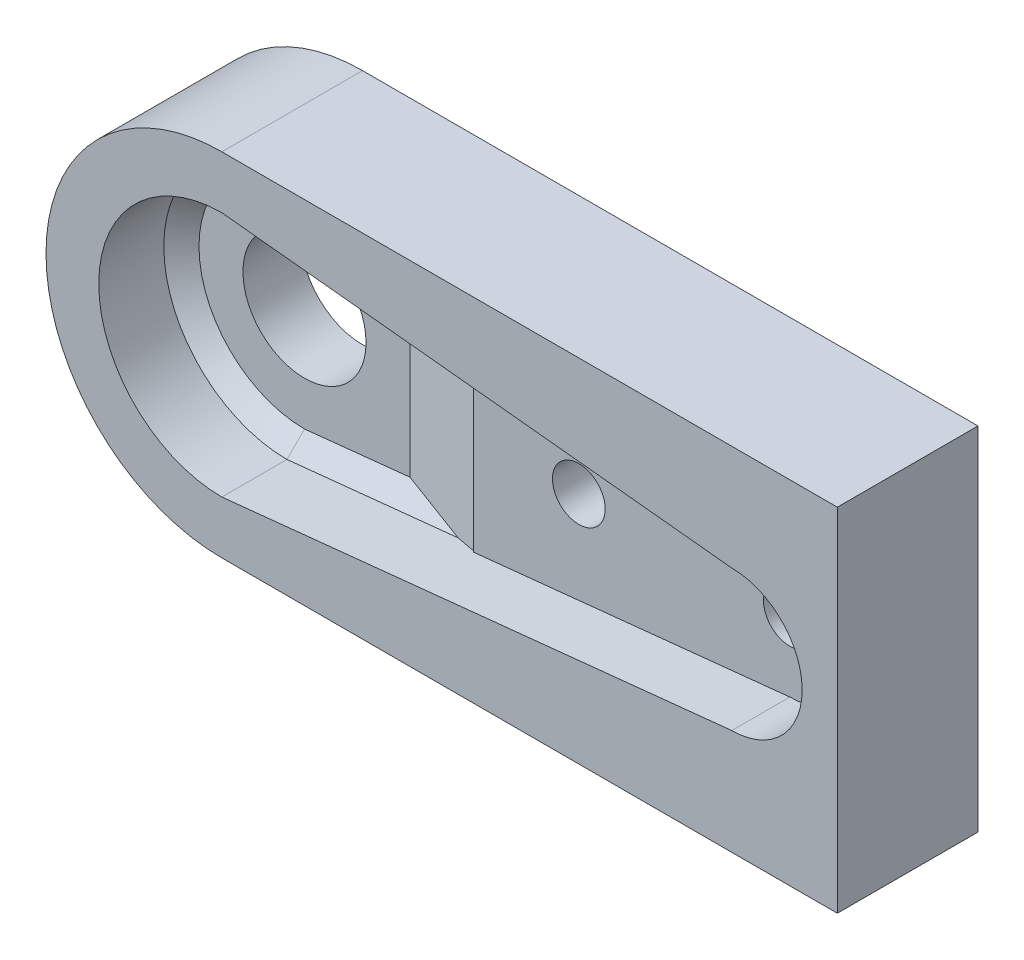
ISO-10303-21;
HEADER;
FILE_DESCRIPTION(('STEP AP214'),'2;1');
FILE_NAME('part.step','',(''),(''),'','','');
FILE_SCHEMA(('AUTOMOTIVE_DESIGN { 1 0 10303 214 1 1 1 1 }'));
ENDSEC;
DATA;
#1=APPLICATION_CONTEXT('core data for automotive mechanical design processes');
#2=APPLICATION_PROTOCOL_DEFINITION('international standard','automotive_design',2000,#1);
#3=PRODUCT_CONTEXT('',#1,'mechanical');
#4=PRODUCT('Part','Part','',(#3));
#5=PRODUCT_RELATED_PRODUCT_CATEGORY('part','',(#4));
#6=PRODUCT_DEFINITION_FORMATION('','',#4);
#7=PRODUCT_DEFINITION_CONTEXT('part definition',#1,'design');
#8=PRODUCT_DEFINITION('design','',#6,#7);
#9=PRODUCT_DEFINITION_SHAPE('','',#8);
#10=(LENGTH_UNIT() NAMED_UNIT(*) SI_UNIT(.MILLI.,.METRE.));
#11=(NAMED_UNIT(*) PLANE_ANGLE_UNIT() SI_UNIT($,.RADIAN.));
#12=(NAMED_UNIT(*) SI_UNIT($,.STERADIAN.) SOLID_ANGLE_UNIT());
#13=UNCERTAINTY_MEASURE_WITH_UNIT(LENGTH_MEASURE(1.E-05),#10,'distance_accuracy_value','');
#14=(GEOMETRIC_REPRESENTATION_CONTEXT(3) GLOBAL_UNCERTAINTY_ASSIGNED_CONTEXT((#13)) GLOBAL_UNIT_ASSIGNED_CONTEXT((#10,
#11,#12)) REPRESENTATION_CONTEXT('',''));
#15=CARTESIAN_POINT('',(0.,0.,0.));
#16=DIRECTION('',(0.,0.,1.));
#17=DIRECTION('',(1.,0.,0.));
#18=AXIS2_PLACEMENT_3D('',#15,#16,#17);
#19=CARTESIAN_POINT('',(0.,3.,4.3));
#20=DIRECTION('',(-0.0727606875108998,0.703353312605365,0.707106781186549));
#21=DIRECTION('',(0.994691793826551,0.102899151085505,0.));
#22=AXIS2_PLACEMENT_3D('',#19,#20,#21);
#23=PLANE('',#22);
#24=CARTESIAN_POINT('',(-0.000546209909035064,4.00528002912067,3.3));
#25=DIRECTION('',(0.994691793826551,0.102899151085505,0.));
#26=VECTOR('',#25,1.);
#27=LINE('',#24,#26);
#28=CARTESIAN_POINT('',(0.,4.00000000000001,3.3));
#29=VERTEX_POINT('',#28);
#30=CARTESIAN_POINT('',(5.99999999999994,4.62602618876643,3.3));
#31=VERTEX_POINT('',#30);
#32=EDGE_CURVE('E197',#29,#31,#27,.T.);
#33=ORIENTED_EDGE('',*,*,#32,.F.);
#34=CARTESIAN_POINT('',(-0.000273104954517369,4.00264001456034,3.30265410308672));
#35=DIRECTION('',(0.000193115045492676,-0.708976050495939,0.70523253082211));
#36=VECTOR('',#35,1.);
#37=LINE('',#34,#36);
#38=CARTESIAN_POINT('',(0.,3.,4.3));
#39=VERTEX_POINT('',#38);
#40=EDGE_CURVE('E206',#29,#39,#37,.T.);
#41=ORIENTED_EDGE('',*,*,#40,.T.);
#42=DIRECTION('',(0.994691793826551,0.102899151085505,0.));
#43=VECTOR('',#42,1.);
#44=CARTESIAN_POINT('',(0.,3.,4.3));
#45=LINE('',#44,#43);
#46=CARTESIAN_POINT('',(9.73205080756886,4.00676387664505,4.3));
#47=VERTEX_POINT('',#46);
#48=EDGE_CURVE('E189',#39,#47,#45,.T.);
#49=ORIENTED_EDGE('',*,*,#48,.T.);
#50=DIRECTION('',(0.953753176121489,-0.158257062267283,0.255557393320368));
#51=VECTOR('',#50,1.);
#52=CARTESIAN_POINT('',(10.9484457034078,3.80492645414208,4.62593203001738));
#53=LINE('',#52,#51);
#54=EDGE_CURVE('E188',#47,#31,#53,.F.);
#55=ORIENTED_EDGE('',*,*,#54,.T.);
#56=EDGE_LOOP('',(#33,#41,#49,#55));
#57=FACE_BOUND('',#56,.T.);
#58=ADVANCED_FACE('F34',(#57),#23,.T.);
#59=CARTESIAN_POINT('',(0.,10.,8.));
#60=DIRECTION('',(0.,0.,1.));
#61=DIRECTION('',(1.,0.,0.));
#62=AXIS2_PLACEMENT_3D('',#59,#60,#61);
#63=PLANE('',#62);
#64=CARTESIAN_POINT('',(0.,10.,8.));
#65=DIRECTION('',(0.,0.,1.));
#66=DIRECTION('',(1.,0.,0.));
#67=AXIS2_PLACEMENT_3D('',#64,#65,#66);
#68=CIRCLE('',#67,10.);
#69=CARTESIAN_POINT('',(0.,20.,8.));
#70=VERTEX_POINT('',#69);
#71=CARTESIAN_POINT('',(0.,0.,8.));
#72=VERTEX_POINT('',#71);
#73=EDGE_CURVE('E497',#70,#72,#68,.T.);
#74=ORIENTED_EDGE('',*,*,#73,.T.);
#75=DIRECTION('',(1.,0.,0.));
#76=VECTOR('',#75,1.);
#77=CARTESIAN_POINT('',(0.,0.,8.));
#78=LINE('',#77,#76);
#79=CARTESIAN_POINT('',(35.,0.,8.));
#80=VERTEX_POINT('',#79);
#81=EDGE_CURVE('E87',#72,#80,#78,.T.);
#82=ORIENTED_EDGE('',*,*,#81,.T.);
#83=DIRECTION('',(0.,1.,0.));
#84=VECTOR('',#83,1.);
#85=CARTESIAN_POINT('',(35.,0.,8.));
#86=LINE('',#85,#84);
#87=CARTESIAN_POINT('',(35.,20.,8.));
#88=VERTEX_POINT('',#87);
#89=EDGE_CURVE('E518',#80,#88,#86,.T.);
#90=ORIENTED_EDGE('',*,*,#89,.T.);
#91=DIRECTION('',(-1.,0.,0.));
#92=VECTOR('',#91,1.);
#93=CARTESIAN_POINT('',(0.,20.,8.));
#94=LINE('',#93,#92);
#95=EDGE_CURVE('E58',#88,#70,#94,.T.);
#96=ORIENTED_EDGE('',*,*,#95,.T.);
#97=EDGE_LOOP('',(#74,#82,#90,#96));
#98=FACE_BOUND('',#97,.T.);
#99=CARTESIAN_POINT('',(0.,10.,8.));
#100=DIRECTION('',(0.,0.,1.));
#101=DIRECTION('',(1.,0.,0.));
#102=AXIS2_PLACEMENT_3D('',#99,#100,#101);
#103=CIRCLE('',#102,7.);
#104=CARTESIAN_POINT('',(0.,3.,8.));
#105=VERTEX_POINT('',#104);
#106=CARTESIAN_POINT('',(0.,17.,8.));
#107=VERTEX_POINT('',#106);
#108=EDGE_CURVE('E43',#105,#107,#103,.F.);
#109=ORIENTED_EDGE('',*,*,#108,.T.);
#110=DIRECTION('',(0.994691793826551,-0.102899151085505,0.));
#111=VECTOR('',#110,1.);
#112=CARTESIAN_POINT('',(0.716470588235294,16.9258823529412,8.));
#113=LINE('',#112,#111);
#114=CARTESIAN_POINT('',(29.,14.,8.));
#115=VERTEX_POINT('',#114);
#116=EDGE_CURVE('E11',#107,#115,#113,.T.);
#117=ORIENTED_EDGE('',*,*,#116,.T.);
#118=CARTESIAN_POINT('',(29.,10.,8.));
#119=DIRECTION('',(0.,0.,1.));
#120=DIRECTION('',(-1.,0.,0.));
#121=AXIS2_PLACEMENT_3D('',#118,#119,#120);
#122=CIRCLE('',#121,4.);
#123=CARTESIAN_POINT('',(29.,6.,8.));
#124=VERTEX_POINT('',#123);
#125=EDGE_CURVE('E165',#124,#115,#122,.T.);
#126=ORIENTED_EDGE('',*,*,#125,.F.);
#127=DIRECTION('',(-0.994691793826551,-0.102899151085505,0.));
#128=VECTOR('',#127,1.);
#129=CARTESIAN_POINT('',(0.716470588235294,3.07411764705882,8.));
#130=LINE('',#129,#128);
#131=EDGE_CURVE('E280',#124,#105,#130,.T.);
#132=ORIENTED_EDGE('',*,*,#131,.T.);
#133=EDGE_LOOP('',(#109,#117,#126,#132));
#134=FACE_BOUND('',#133,.T.);
#135=ADVANCED_FACE('F238',(#98,#134),#63,.T.);
#136=CARTESIAN_POINT('',(0.,10.,8.));
#137=DIRECTION('',(0.,0.,-1.));
#138=DIRECTION('',(-1.,0.,0.));
#139=AXIS2_PLACEMENT_3D('',#136,#137,#138);
#140=CYLINDRICAL_SURFACE('',#139,10.);
#141=CARTESIAN_POINT('',(0.,10.,0.));
#142=DIRECTION('',(0.,0.,1.));
#143=DIRECTION('',(1.,0.,0.));
#144=AXIS2_PLACEMENT_3D('',#141,#142,#143);
#145=CIRCLE('',#144,10.);
#146=CARTESIAN_POINT('',(0.,20.,0.));
#147=VERTEX_POINT('',#146);
#148=CARTESIAN_POINT('',(0.,0.,0.));
#149=VERTEX_POINT('',#148);
#150=EDGE_CURVE('E196',#147,#149,#145,.T.);
#151=ORIENTED_EDGE('',*,*,#150,.T.);
#152=DIRECTION('',(0.,0.,-1.));
#153=VECTOR('',#152,1.);
#154=CARTESIAN_POINT('',(0.,0.,8.));
#155=LINE('',#154,#153);
#156=EDGE_CURVE('E290',#72,#149,#155,.T.);
#157=ORIENTED_EDGE('',*,*,#156,.F.);
#158=ORIENTED_EDGE('',*,*,#73,.F.);
#159=DIRECTION('',(0.,0.,-1.));
#160=VECTOR('',#159,1.);
#161=CARTESIAN_POINT('',(0.,20.,8.));
#162=LINE('',#161,#160);
#163=EDGE_CURVE('E509',#70,#147,#162,.T.);
#164=ORIENTED_EDGE('',*,*,#163,.T.);
#165=EDGE_LOOP('',(#151,#157,#158,#164));
#166=FACE_BOUND('',#165,.T.);
#167=ADVANCED_FACE('F36',(#166),#140,.T.);
#168=CARTESIAN_POINT('',(0.,0.,8.));
#169=DIRECTION('',(0.,1.,0.));
#170=DIRECTION('',(-1.,0.,0.));
#171=AXIS2_PLACEMENT_3D('',#168,#169,#170);
#172=PLANE('',#171);
#173=DIRECTION('',(1.,0.,0.));
#174=VECTOR('',#173,1.);
#175=CARTESIAN_POINT('',(0.,0.,0.));
#176=LINE('',#175,#174);
#177=CARTESIAN_POINT('',(35.,0.,0.));
#178=VERTEX_POINT('',#177);
#179=EDGE_CURVE('E514',#149,#178,#176,.T.);
#180=ORIENTED_EDGE('',*,*,#179,.T.);
#181=DIRECTION('',(0.,0.,-1.));
#182=VECTOR('',#181,1.);
#183=CARTESIAN_POINT('',(35.,0.,8.));
#184=LINE('',#183,#182);
#185=EDGE_CURVE('E502',#80,#178,#184,.T.);
#186=ORIENTED_EDGE('',*,*,#185,.F.);
#187=ORIENTED_EDGE('',*,*,#81,.F.);
#188=ORIENTED_EDGE('',*,*,#156,.T.);
#189=EDGE_LOOP('',(#180,#186,#187,#188));
#190=FACE_BOUND('',#189,.T.);
#191=ADVANCED_FACE('F463',(#190),#172,.F.);
#192=CARTESIAN_POINT('',(35.,0.,8.));
#193=DIRECTION('',(-1.,0.,0.));
#194=DIRECTION('',(0.,-1.,0.));
#195=AXIS2_PLACEMENT_3D('',#192,#193,#194);
#196=PLANE('',#195);
#197=DIRECTION('',(0.,1.,0.));
#198=VECTOR('',#197,1.);
#199=CARTESIAN_POINT('',(35.,0.,0.));
#200=LINE('',#199,#198);
#201=CARTESIAN_POINT('',(35.,20.,0.));
#202=VERTEX_POINT('',#201);
#203=EDGE_CURVE('E512',#178,#202,#200,.T.);
#204=ORIENTED_EDGE('',*,*,#203,.T.);
#205=DIRECTION('',(0.,0.,-1.));
#206=VECTOR('',#205,1.);
#207=CARTESIAN_POINT('',(35.,20.,8.));
#208=LINE('',#207,#206);
#209=EDGE_CURVE('E505',#88,#202,#208,.T.);
#210=ORIENTED_EDGE('',*,*,#209,.F.);
#211=ORIENTED_EDGE('',*,*,#89,.F.);
#212=ORIENTED_EDGE('',*,*,#185,.T.);
#213=EDGE_LOOP('',(#204,#210,#211,#212));
#214=FACE_BOUND('',#213,.T.);
#215=ADVANCED_FACE('F454',(#214),#196,.F.);
#216=CARTESIAN_POINT('',(0.,20.,8.));
#217=DIRECTION('',(0.,-1.,0.));
#218=DIRECTION('',(0.,0.,-1.));
#219=AXIS2_PLACEMENT_3D('',#216,#217,#218);
#220=PLANE('',#219);
#221=DIRECTION('',(-1.,0.,0.));
#222=VECTOR('',#221,1.);
#223=CARTESIAN_POINT('',(0.,20.,0.));
#224=LINE('',#223,#222);
#225=EDGE_CURVE('E79',#202,#147,#224,.T.);
#226=ORIENTED_EDGE('',*,*,#225,.T.);
#227=ORIENTED_EDGE('',*,*,#163,.F.);
#228=ORIENTED_EDGE('',*,*,#95,.F.);
#229=ORIENTED_EDGE('',*,*,#209,.T.);
#230=EDGE_LOOP('',(#226,#227,#228,#229));
#231=FACE_BOUND('',#230,.T.);
#232=ADVANCED_FACE('F449',(#231),#220,.F.);
#233=CARTESIAN_POINT('',(0.,10.,0.));
#234=DIRECTION('',(0.,0.,1.));
#235=DIRECTION('',(1.,0.,0.));
#236=AXIS2_PLACEMENT_3D('',#233,#234,#235);
#237=PLANE('',#236);
#238=CARTESIAN_POINT('',(17.,9.99999999999992,0.));
#239=DIRECTION('',(0.,0.,1.));
#240=DIRECTION('',(1.,0.,0.));
#241=AXIS2_PLACEMENT_3D('',#238,#239,#240);
#242=CIRCLE('',#241,1.5);
#243=CARTESIAN_POINT('',(18.5,9.99999999999992,0.));
#244=VERTEX_POINT('',#243);
#245=EDGE_CURVE('E262',#244,#244,#242,.T.);
#246=ORIENTED_EDGE('',*,*,#245,.T.);
#247=EDGE_LOOP('',(#246));
#248=FACE_BOUND('',#247,.T.);
#249=CARTESIAN_POINT('',(29.,10.,0.));
#250=DIRECTION('',(0.,0.,1.));
#251=DIRECTION('',(1.,0.,0.));
#252=AXIS2_PLACEMENT_3D('',#249,#250,#251);
#253=CIRCLE('',#252,1.5);
#254=CARTESIAN_POINT('',(30.5,10.,0.));
#255=VERTEX_POINT('',#254);
#256=EDGE_CURVE('E267',#255,#255,#253,.T.);
#257=ORIENTED_EDGE('',*,*,#256,.T.);
#258=EDGE_LOOP('',(#257));
#259=FACE_BOUND('',#258,.T.);
#260=CARTESIAN_POINT('',(0.,10.,0.));
#261=DIRECTION('',(0.,0.,1.));
#262=DIRECTION('',(1.,0.,0.));
#263=AXIS2_PLACEMENT_3D('',#260,#261,#262);
#264=CIRCLE('',#263,3.5);
#265=CARTESIAN_POINT('',(3.5,10.,0.));
#266=VERTEX_POINT('',#265);
#267=EDGE_CURVE('E259',#266,#266,#264,.T.);
#268=ORIENTED_EDGE('',*,*,#267,.T.);
#269=EDGE_LOOP('',(#268));
#270=FACE_BOUND('',#269,.T.);
#271=ORIENTED_EDGE('',*,*,#150,.F.);
#272=ORIENTED_EDGE('',*,*,#225,.F.);
#273=ORIENTED_EDGE('',*,*,#203,.F.);
#274=ORIENTED_EDGE('',*,*,#179,.F.);
#275=EDGE_LOOP('',(#271,#272,#273,#274));
#276=FACE_BOUND('',#275,.T.);
#277=ADVANCED_FACE('F319',(#248,#259,#270,#276),#237,.F.);
#278=CARTESIAN_POINT('',(0.,10.,4.7));
#279=DIRECTION('',(0.,0.,1.));
#280=DIRECTION('',(1.,0.,0.));
#281=AXIS2_PLACEMENT_3D('',#278,#279,#280);
#282=PLANE('',#281);
#283=CARTESIAN_POINT('',(17.,9.99999999999992,4.7));
#284=DIRECTION('',(0.,0.,1.));
#285=DIRECTION('',(1.,0.,0.));
#286=AXIS2_PLACEMENT_3D('',#283,#284,#285);
#287=CIRCLE('',#286,1.5);
#288=CARTESIAN_POINT('',(18.5,9.99999999999992,4.7));
#289=VERTEX_POINT('',#288);
#290=EDGE_CURVE('E38',#289,#289,#287,.T.);
#291=ORIENTED_EDGE('',*,*,#290,.F.);
#292=EDGE_LOOP('',(#291));
#293=FACE_BOUND('',#292,.T.);
#294=CARTESIAN_POINT('',(29.,10.,4.7));
#295=DIRECTION('',(0.,0.,1.));
#296=DIRECTION('',(1.,0.,0.));
#297=AXIS2_PLACEMENT_3D('',#294,#295,#296);
#298=CIRCLE('',#297,1.5);
#299=CARTESIAN_POINT('',(30.5,10.,4.7));
#300=VERTEX_POINT('',#299);
#301=EDGE_CURVE('E260',#300,#300,#298,.T.);
#302=ORIENTED_EDGE('',*,*,#301,.F.);
#303=EDGE_LOOP('',(#302));
#304=FACE_BOUND('',#303,.T.);
#305=DIRECTION('',(0.994691793826551,0.102899151085505,0.));
#306=VECTOR('',#305,1.);
#307=CARTESIAN_POINT('',(0.,3.,4.7));
#308=LINE('',#307,#306);
#309=CARTESIAN_POINT('',(11.,4.13793103448276,4.7));
#310=VERTEX_POINT('',#309);
#311=CARTESIAN_POINT('',(29.,6.,4.7));
#312=VERTEX_POINT('',#311);
#313=EDGE_CURVE('E159',#310,#312,#308,.T.);
#314=ORIENTED_EDGE('',*,*,#313,.T.);
#315=CARTESIAN_POINT('',(29.,10.,4.7));
#316=DIRECTION('',(0.,0.,1.));
#317=DIRECTION('',(-1.,0.,0.));
#318=AXIS2_PLACEMENT_3D('',#315,#316,#317);
#319=CIRCLE('',#318,4.);
#320=CARTESIAN_POINT('',(29.,14.,4.7));
#321=VERTEX_POINT('',#320);
#322=EDGE_CURVE('E163',#312,#321,#319,.T.);
#323=ORIENTED_EDGE('',*,*,#322,.T.);
#324=DIRECTION('',(-0.994691793826551,0.102899151085505,0.));
#325=VECTOR('',#324,1.);
#326=CARTESIAN_POINT('',(29.,14.,4.7));
#327=LINE('',#326,#325);
#328=CARTESIAN_POINT('',(11.,15.8620689655172,4.7));
#329=VERTEX_POINT('',#328);
#330=EDGE_CURVE('E144',#321,#329,#327,.T.);
#331=ORIENTED_EDGE('',*,*,#330,.T.);
#332=DIRECTION('',(0.,1.,0.));
#333=VECTOR('',#332,1.);
#334=CARTESIAN_POINT('',(11.,10.,4.7));
#335=LINE('',#334,#333);
#336=EDGE_CURVE('E151',#310,#329,#335,.T.);
#337=ORIENTED_EDGE('',*,*,#336,.F.);
#338=EDGE_LOOP('',(#314,#323,#331,#337));
#339=FACE_BOUND('',#338,.T.);
#340=ADVANCED_FACE('F161',(#293,#304,#339),#282,.T.);
#341=CARTESIAN_POINT('',(0.,10.,8.));
#342=DIRECTION('',(0.,0.,-1.));
#343=DIRECTION('',(-1.,0.,0.));
#344=AXIS2_PLACEMENT_3D('',#341,#342,#343);
#345=CYLINDRICAL_SURFACE('',#344,7.);
#346=DIRECTION('',(0.,0.,-1.));
#347=VECTOR('',#346,1.);
#348=CARTESIAN_POINT('',(0.,3.,8.));
#349=LINE('',#348,#347);
#350=EDGE_CURVE('E179',#105,#39,#349,.T.);
#351=ORIENTED_EDGE('',*,*,#350,.T.);
#352=CARTESIAN_POINT('',(0.,10.,4.3));
#353=DIRECTION('',(0.,0.,1.));
#354=DIRECTION('',(1.,0.,0.));
#355=AXIS2_PLACEMENT_3D('',#352,#353,#354);
#356=CIRCLE('',#355,7.);
#357=CARTESIAN_POINT('',(0.,17.,4.3));
#358=VERTEX_POINT('',#357);
#359=EDGE_CURVE('E288',#358,#39,#356,.T.);
#360=ORIENTED_EDGE('',*,*,#359,.F.);
#361=DIRECTION('',(0.,0.,-1.));
#362=VECTOR('',#361,1.);
#363=CARTESIAN_POINT('',(0.,17.,8.));
#364=LINE('',#363,#362);
#365=EDGE_CURVE('E168',#107,#358,#364,.T.);
#366=ORIENTED_EDGE('',*,*,#365,.F.);
#367=ORIENTED_EDGE('',*,*,#108,.F.);
#368=EDGE_LOOP('',(#351,#360,#366,#367));
#369=FACE_BOUND('',#368,.T.);
#370=ADVANCED_FACE('F287',(#369),#345,.F.);
#371=CARTESIAN_POINT('',(0.,3.,8.));
#372=DIRECTION('',(-0.102899151085505,0.994691793826551,0.));
#373=DIRECTION('',(-0.994691793826551,-0.102899151085505,0.));
#374=AXIS2_PLACEMENT_3D('',#371,#372,#373);
#375=PLANE('',#374);
#376=ORIENTED_EDGE('',*,*,#313,.F.);
#377=DIRECTION('',(0.,0.,1.));
#378=VECTOR('',#377,1.);
#379=CARTESIAN_POINT('',(11.,4.13793103448276,3.3));
#380=LINE('',#379,#378);
#381=CARTESIAN_POINT('',(11.,4.13793103448276,4.63974596215562));
#382=VERTEX_POINT('',#381);
#383=EDGE_CURVE('E152',#382,#310,#380,.T.);
#384=ORIENTED_EDGE('',*,*,#383,.F.);
#385=DIRECTION('',(0.961139410487415,0.0994282148780084,0.257536528853825));
#386=VECTOR('',#385,1.);
#387=CARTESIAN_POINT('',(11.,4.13793103448276,4.63974596215562));
#388=LINE('',#387,#386);
#389=EDGE_CURVE('E181',#47,#382,#388,.T.);
#390=ORIENTED_EDGE('',*,*,#389,.F.);
#391=ORIENTED_EDGE('',*,*,#48,.F.);
#392=ORIENTED_EDGE('',*,*,#350,.F.);
#393=ORIENTED_EDGE('',*,*,#131,.F.);
#394=DIRECTION('',(0.,0.,-1.));
#395=VECTOR('',#394,1.);
#396=CARTESIAN_POINT('',(29.,6.,8.));
#397=LINE('',#396,#395);
#398=EDGE_CURVE('E176',#124,#312,#397,.T.);
#399=ORIENTED_EDGE('',*,*,#398,.T.);
#400=EDGE_LOOP('',(#376,#384,#390,#391,#392,#393,#399));
#401=FACE_BOUND('',#400,.T.);
#402=ADVANCED_FACE('F278',(#401),#375,.T.);
#403=CARTESIAN_POINT('',(29.,10.,8.));
#404=DIRECTION('',(0.,0.,-1.));
#405=DIRECTION('',(-1.,0.,0.));
#406=AXIS2_PLACEMENT_3D('',#403,#404,#405);
#407=CYLINDRICAL_SURFACE('',#406,4.);
#408=ORIENTED_EDGE('',*,*,#322,.F.);
#409=ORIENTED_EDGE('',*,*,#398,.F.);
#410=ORIENTED_EDGE('',*,*,#125,.T.);
#411=DIRECTION('',(0.,0.,-1.));
#412=VECTOR('',#411,1.);
#413=CARTESIAN_POINT('',(29.,14.,8.));
#414=LINE('',#413,#412);
#415=EDGE_CURVE('E174',#115,#321,#414,.T.);
#416=ORIENTED_EDGE('',*,*,#415,.T.);
#417=EDGE_LOOP('',(#408,#409,#410,#416));
#418=FACE_BOUND('',#417,.T.);
#419=ADVANCED_FACE('F282',(#418),#407,.F.);
#420=CARTESIAN_POINT('',(29.,14.,8.));
#421=DIRECTION('',(-0.102899151085505,-0.994691793826551,0.));
#422=DIRECTION('',(0.994691793826551,-0.102899151085505,0.));
#423=AXIS2_PLACEMENT_3D('',#420,#421,#422);
#424=PLANE('',#423);
#425=ORIENTED_EDGE('',*,*,#415,.F.);
#426=ORIENTED_EDGE('',*,*,#116,.F.);
#427=ORIENTED_EDGE('',*,*,#365,.T.);
#428=DIRECTION('',(-0.994691793826551,0.102899151085505,0.));
#429=VECTOR('',#428,1.);
#430=CARTESIAN_POINT('',(29.,14.,4.3));
#431=LINE('',#430,#429);
#432=CARTESIAN_POINT('',(9.73205080756886,15.9932361233549,4.3));
#433=VERTEX_POINT('',#432);
#434=EDGE_CURVE('E193',#433,#358,#431,.T.);
#435=ORIENTED_EDGE('',*,*,#434,.F.);
#436=DIRECTION('',(-0.961139410487415,0.0994282148780085,-0.257536528853825));
#437=VECTOR('',#436,1.);
#438=CARTESIAN_POINT('',(12.1204099235671,15.7461644906655,4.93995889636724));
#439=LINE('',#438,#437);
#440=CARTESIAN_POINT('',(11.,15.8620689655172,4.63974596215562));
#441=VERTEX_POINT('',#440);
#442=EDGE_CURVE('E147',#441,#433,#439,.T.);
#443=ORIENTED_EDGE('',*,*,#442,.F.);
#444=DIRECTION('',(0.,0.,1.));
#445=VECTOR('',#444,1.);
#446=CARTESIAN_POINT('',(11.,15.8620689655172,3.3));
#447=LINE('',#446,#445);
#448=EDGE_CURVE('E140',#441,#329,#447,.T.);
#449=ORIENTED_EDGE('',*,*,#448,.T.);
#450=ORIENTED_EDGE('',*,*,#330,.F.);
#451=EDGE_LOOP('',(#425,#426,#427,#435,#443,#449,#450));
#452=FACE_BOUND('',#451,.T.);
#453=ADVANCED_FACE('F142',(#452),#424,.T.);
#454=CARTESIAN_POINT('',(11.,4.13793103448276,3.3));
#455=DIRECTION('',(1.,0.,0.));
#456=DIRECTION('',(0.,0.,-1.));
#457=AXIS2_PLACEMENT_3D('',#454,#455,#456);
#458=PLANE('',#457);
#459=ORIENTED_EDGE('',*,*,#383,.T.);
#460=ORIENTED_EDGE('',*,*,#336,.T.);
#461=ORIENTED_EDGE('',*,*,#448,.F.);
#462=DIRECTION('',(0.,1.,0.));
#463=VECTOR('',#462,1.);
#464=CARTESIAN_POINT('',(11.,15.8620689655172,4.63974596215562));
#465=LINE('',#464,#463);
#466=EDGE_CURVE('E183',#382,#441,#465,.T.);
#467=ORIENTED_EDGE('',*,*,#466,.F.);
#468=EDGE_LOOP('',(#459,#460,#461,#467));
#469=FACE_BOUND('',#468,.T.);
#470=ADVANCED_FACE('F155',(#469),#458,.F.);
#471=CARTESIAN_POINT('',(0.,10.,3.3));
#472=DIRECTION('',(0.,0.,1.));
#473=DIRECTION('',(1.,0.,0.));
#474=AXIS2_PLACEMENT_3D('',#471,#472,#473);
#475=PLANE('',#474);
#476=CARTESIAN_POINT('',(0.,10.,3.3));
#477=DIRECTION('',(0.,0.,1.));
#478=DIRECTION('',(1.,0.,0.));
#479=AXIS2_PLACEMENT_3D('',#476,#477,#478);
#480=CIRCLE('',#479,3.5);
#481=CARTESIAN_POINT('',(3.5,10.,3.3));
#482=VERTEX_POINT('',#481);
#483=EDGE_CURVE('E252',#482,#482,#480,.T.);
#484=ORIENTED_EDGE('',*,*,#483,.F.);
#485=EDGE_LOOP('',(#484));
#486=FACE_BOUND('',#485,.T.);
#487=ORIENTED_EDGE('',*,*,#32,.T.);
#488=DIRECTION('',(0.,-1.,0.));
#489=VECTOR('',#488,1.);
#490=CARTESIAN_POINT('',(5.99999999999994,4.13793103448276,3.3));
#491=LINE('',#490,#489);
#492=CARTESIAN_POINT('',(5.99999999999994,15.3739738112336,3.3));
#493=VERTEX_POINT('',#492);
#494=EDGE_CURVE('E185',#493,#31,#491,.T.);
#495=ORIENTED_EDGE('',*,*,#494,.F.);
#496=DIRECTION('',(0.994691793826551,-0.102899151085505,0.));
#497=VECTOR('',#496,1.);
#498=CARTESIAN_POINT('',(0.613571437149789,15.9311905591146,3.3));
#499=LINE('',#498,#497);
#500=CARTESIAN_POINT('',(-0.0496043169980762,15.9997949474747,3.3));
#501=VERTEX_POINT('',#500);
#502=EDGE_CURVE('E190',#501,#493,#499,.T.);
#503=ORIENTED_EDGE('',*,*,#502,.F.);
#504=CARTESIAN_POINT('',(0.,10.,3.3));
#505=DIRECTION('',(0.,0.,1.));
#506=DIRECTION('',(1.,0.,0.));
#507=AXIS2_PLACEMENT_3D('',#504,#505,#506);
#508=CIRCLE('',#507,6.);
#509=EDGE_CURVE('E192',#29,#501,#508,.F.);
#510=ORIENTED_EDGE('',*,*,#509,.F.);
#511=EDGE_LOOP('',(#487,#495,#503,#510));
#512=FACE_BOUND('',#511,.T.);
#513=ADVANCED_FACE('F303',(#486,#512),#475,.T.);
#514=CARTESIAN_POINT('',(11.,4.13793103448276,4.63974596215562));
#515=DIRECTION('',(0.258819045102518,0.,-0.965925826289069));
#516=DIRECTION('',(0.,-1.,0.));
#517=AXIS2_PLACEMENT_3D('',#514,#515,#516);
#518=PLANE('',#517);
#519=ORIENTED_EDGE('',*,*,#389,.T.);
#520=ORIENTED_EDGE('',*,*,#466,.T.);
#521=ORIENTED_EDGE('',*,*,#442,.T.);
#522=DIRECTION('',(-0.953753176121489,-0.158257062267283,-0.255557393320368));
#523=VECTOR('',#522,1.);
#524=CARTESIAN_POINT('',(9.17882571149173,15.9014390204255,4.15176378227351));
#525=LINE('',#524,#523);
#526=EDGE_CURVE('E186',#493,#433,#525,.F.);
#527=ORIENTED_EDGE('',*,*,#526,.F.);
#528=ORIENTED_EDGE('',*,*,#494,.T.);
#529=ORIENTED_EDGE('',*,*,#54,.F.);
#530=EDGE_LOOP('',(#519,#520,#521,#527,#528,#529));
#531=FACE_BOUND('',#530,.T.);
#532=ADVANCED_FACE('F228',(#531),#518,.F.);
#533=CARTESIAN_POINT('',(29.,14.,4.3));
#534=DIRECTION('',(-0.0727606875108998,-0.703353312605364,0.707106781186549));
#535=DIRECTION('',(-0.994691793826551,0.102899151085505,0.));
#536=AXIS2_PLACEMENT_3D('',#533,#534,#535);
#537=PLANE('',#536);
#538=ORIENTED_EDGE('',*,*,#526,.T.);
#539=ORIENTED_EDGE('',*,*,#434,.T.);
#540=CARTESIAN_POINT('',(-0.0496043169981482,15.999794947474,3.3));
#541=CARTESIAN_POINT('',(-0.0416803846225778,16.1665220523745,3.46665744896728));
#542=CARTESIAN_POINT('',(-0.0335847251753897,16.3332360292908,3.63331951020649));
#543=CARTESIAN_POINT('',(-0.0170499528167752,16.6666377134641,3.96665284354052));
#544=CARTESIAN_POINT('',(-0.00861083993355665,16.8333254207233,4.13332411563457));
#545=CARTESIAN_POINT('',(-6.92805188218237E-12,17.0000000000005,4.29999999999981));
#546=B_SPLINE_CURVE_WITH_KNOTS('',3,(#540,#541,#542,#543,#544,#545),.UNSPECIFIED.,.F.,.F.,(4,2,
4),(0.,0.707614296152071,1.41522853418804),.UNSPECIFIED.);
#547=EDGE_CURVE('E211',#358,#501,#546,.F.);
#548=ORIENTED_EDGE('',*,*,#547,.T.);
#549=ORIENTED_EDGE('',*,*,#502,.T.);
#550=EDGE_LOOP('',(#538,#539,#548,#549));
#551=FACE_BOUND('',#550,.T.);
#552=ADVANCED_FACE('F227',(#551),#537,.T.);
#553=CARTESIAN_POINT('',(0.,10.,4.3));
#554=DIRECTION('',(0.,0.,1.));
#555=DIRECTION('',(1.,0.,0.));
#556=AXIS2_PLACEMENT_3D('',#553,#554,#555);
#557=CONICAL_SURFACE('',#556,7.,0.78539816339745);
#558=ORIENTED_EDGE('',*,*,#547,.F.);
#559=ORIENTED_EDGE('',*,*,#359,.T.);
#560=ORIENTED_EDGE('',*,*,#40,.F.);
#561=ORIENTED_EDGE('',*,*,#509,.T.);
#562=EDGE_LOOP('',(#558,#559,#560,#561));
#563=FACE_BOUND('',#562,.T.);
#564=ADVANCED_FACE('F217',(#563),#557,.F.);
#565=CARTESIAN_POINT('',(0.,10.,0.));
#566=DIRECTION('',(0.,0.,1.));
#567=DIRECTION('',(1.,0.,0.));
#568=AXIS2_PLACEMENT_3D('',#565,#566,#567);
#569=CYLINDRICAL_SURFACE('',#568,3.5);
#570=ORIENTED_EDGE('',*,*,#483,.T.);
#571=EDGE_LOOP('',(#570));
#572=FACE_BOUND('',#571,.T.);
#573=ORIENTED_EDGE('',*,*,#267,.F.);
#574=EDGE_LOOP('',(#573));
#575=FACE_BOUND('',#574,.T.);
#576=ADVANCED_FACE('F226',(#572,#575),#569,.F.);
#577=CARTESIAN_POINT('',(29.,10.,0.));
#578=DIRECTION('',(0.,0.,1.));
#579=DIRECTION('',(1.,0.,0.));
#580=AXIS2_PLACEMENT_3D('',#577,#578,#579);
#581=CYLINDRICAL_SURFACE('',#580,1.5);
#582=ORIENTED_EDGE('',*,*,#301,.T.);
#583=EDGE_LOOP('',(#582));
#584=FACE_BOUND('',#583,.T.);
#585=ORIENTED_EDGE('',*,*,#256,.F.);
#586=EDGE_LOOP('',(#585));
#587=FACE_BOUND('',#586,.T.);
#588=ADVANCED_FACE('F373',(#584,#587),#581,.F.);
#589=CARTESIAN_POINT('',(17.,9.99999999999992,0.));
#590=DIRECTION('',(0.,0.,1.));
#591=DIRECTION('',(1.,0.,0.));
#592=AXIS2_PLACEMENT_3D('',#589,#590,#591);
#593=CYLINDRICAL_SURFACE('',#592,1.5);
#594=ORIENTED_EDGE('',*,*,#290,.T.);
#595=EDGE_LOOP('',(#594));
#596=FACE_BOUND('',#595,.T.);
#597=ORIENTED_EDGE('',*,*,#245,.F.);
#598=EDGE_LOOP('',(#597));
#599=FACE_BOUND('',#598,.T.);
#600=ADVANCED_FACE('F380',(#596,#599),#593,.F.);
#601=CLOSED_SHELL('',(#58,#135,#167,#191,#215,#232,#277,#340,#370,#402,#419,#453,#470,#513,#532,
#552,#564,#576,#588,#600));
#602=MANIFOLD_SOLID_BREP('B2',#601);
#603=ADVANCED_BREP_SHAPE_REPRESENTATION('',(#18,#602),#14);
#604=SHAPE_DEFINITION_REPRESENTATION(#9,#603);
ENDSEC;
END-ISO-10303-21;
